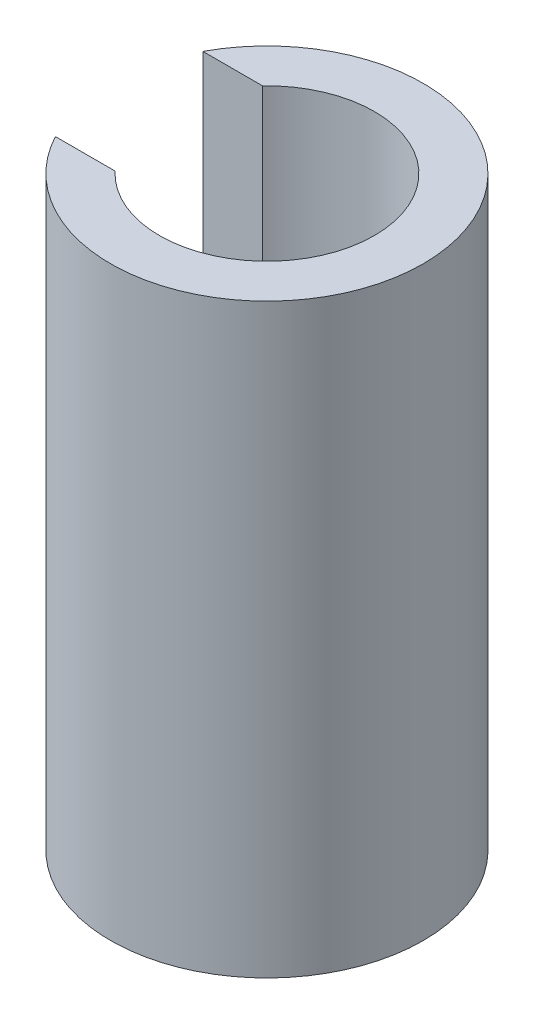
ISO-10303-21;
HEADER;
FILE_DESCRIPTION(('STEP AP214'),'2;1');
FILE_NAME('part.step','',(''),(''),'','','');
FILE_SCHEMA(('AUTOMOTIVE_DESIGN { 1 0 10303 214 1 1 1 1 }'));
ENDSEC;
DATA;
#1=APPLICATION_CONTEXT('core data for automotive mechanical design processes');
#2=APPLICATION_PROTOCOL_DEFINITION('international standard','automotive_design',2000,#1);
#3=PRODUCT_CONTEXT('',#1,'mechanical');
#4=PRODUCT('Part','Part','',(#3));
#5=PRODUCT_RELATED_PRODUCT_CATEGORY('part','',(#4));
#6=PRODUCT_DEFINITION_FORMATION('','',#4);
#7=PRODUCT_DEFINITION_CONTEXT('part definition',#1,'design');
#8=PRODUCT_DEFINITION('design','',#6,#7);
#9=PRODUCT_DEFINITION_SHAPE('','',#8);
#10=(LENGTH_UNIT() NAMED_UNIT(*) SI_UNIT(.MILLI.,.METRE.));
#11=(NAMED_UNIT(*) PLANE_ANGLE_UNIT() SI_UNIT($,.RADIAN.));
#12=(NAMED_UNIT(*) SI_UNIT($,.STERADIAN.) SOLID_ANGLE_UNIT());
#13=UNCERTAINTY_MEASURE_WITH_UNIT(LENGTH_MEASURE(1.E-05),#10,'distance_accuracy_value','');
#14=(GEOMETRIC_REPRESENTATION_CONTEXT(3) GLOBAL_UNCERTAINTY_ASSIGNED_CONTEXT((#13)) GLOBAL_UNIT_ASSIGNED_CONTEXT((#10,
#11,#12)) REPRESENTATION_CONTEXT('',''));
#15=CARTESIAN_POINT('',(0.,0.,0.));
#16=DIRECTION('',(0.,0.,1.));
#17=DIRECTION('',(1.,0.,0.));
#18=AXIS2_PLACEMENT_3D('',#15,#16,#17);
#19=CARTESIAN_POINT('',(0.,15.,0.));
#20=DIRECTION('',(0.,1.,0.));
#21=DIRECTION('',(0.,0.,1.));
#22=AXIS2_PLACEMENT_3D('',#19,#20,#21);
#23=PLANE('',#22);
#24=DIRECTION('',(-1.,0.,0.));
#25=VECTOR('',#24,1.);
#26=CARTESIAN_POINT('',(-4.,15.,-1.88745860881769));
#27=LINE('',#26,#25);
#28=CARTESIAN_POINT('',(-2.,15.,-1.88745860881769));
#29=VERTEX_POINT('',#28);
#30=CARTESIAN_POINT('',(-3.52668399491647,15.,-1.88745860881769));
#31=VERTEX_POINT('',#30);
#32=EDGE_CURVE('E91',#29,#31,#27,.T.);
#33=ORIENTED_EDGE('',*,*,#32,.F.);
#34=CARTESIAN_POINT('',(0.,15.,0.));
#35=DIRECTION('',(0.,1.,0.));
#36=DIRECTION('',(0.,0.,1.));
#37=AXIS2_PLACEMENT_3D('',#34,#35,#36);
#38=CIRCLE('',#37,2.75);
#39=CARTESIAN_POINT('',(-2.,15.,1.88745860881769));
#40=VERTEX_POINT('',#39);
#41=EDGE_CURVE('E94',#40,#29,#38,.T.);
#42=ORIENTED_EDGE('',*,*,#41,.F.);
#43=DIRECTION('',(1.,0.,0.));
#44=VECTOR('',#43,1.);
#45=CARTESIAN_POINT('',(-4.,15.,1.88745860881769));
#46=LINE('',#45,#44);
#47=CARTESIAN_POINT('',(-3.52668399491647,15.,1.88745860881769));
#48=VERTEX_POINT('',#47);
#49=EDGE_CURVE('E59',#48,#40,#46,.T.);
#50=ORIENTED_EDGE('',*,*,#49,.F.);
#51=CARTESIAN_POINT('',(0.,15.,0.));
#52=DIRECTION('',(0.,1.,0.));
#53=DIRECTION('',(0.,0.,1.));
#54=AXIS2_PLACEMENT_3D('',#51,#52,#53);
#55=CIRCLE('',#54,4.);
#56=EDGE_CURVE('E11',#48,#31,#55,.T.);
#57=ORIENTED_EDGE('',*,*,#56,.T.);
#58=EDGE_LOOP('',(#33,#42,#50,#57));
#59=FACE_BOUND('',#58,.T.);
#60=ADVANCED_FACE('F36',(#59),#23,.T.);
#61=CARTESIAN_POINT('',(0.,0.,0.));
#62=DIRECTION('',(0.,1.,0.));
#63=DIRECTION('',(0.,0.,1.));
#64=AXIS2_PLACEMENT_3D('',#61,#62,#63);
#65=PLANE('',#64);
#66=CARTESIAN_POINT('',(0.,0.,0.));
#67=DIRECTION('',(0.,1.,0.));
#68=DIRECTION('',(0.,0.,1.));
#69=AXIS2_PLACEMENT_3D('',#66,#67,#68);
#70=CIRCLE('',#69,2.75);
#71=CARTESIAN_POINT('',(-2.,0.,1.88745860881769));
#72=VERTEX_POINT('',#71);
#73=CARTESIAN_POINT('',(-2.,0.,-1.88745860881769));
#74=VERTEX_POINT('',#73);
#75=EDGE_CURVE('E89',#72,#74,#70,.T.);
#76=ORIENTED_EDGE('',*,*,#75,.T.);
#77=DIRECTION('',(-1.,0.,0.));
#78=VECTOR('',#77,1.);
#79=CARTESIAN_POINT('',(-4.,0.,-1.88745860881769));
#80=LINE('',#79,#78);
#81=CARTESIAN_POINT('',(-3.52668399491647,0.,-1.88745860881769));
#82=VERTEX_POINT('',#81);
#83=EDGE_CURVE('E51',#74,#82,#80,.T.);
#84=ORIENTED_EDGE('',*,*,#83,.T.);
#85=CARTESIAN_POINT('',(0.,0.,0.));
#86=DIRECTION('',(0.,1.,0.));
#87=DIRECTION('',(0.,0.,1.));
#88=AXIS2_PLACEMENT_3D('',#85,#86,#87);
#89=CIRCLE('',#88,4.);
#90=CARTESIAN_POINT('',(-3.52668399491647,0.,1.88745860881769));
#91=VERTEX_POINT('',#90);
#92=EDGE_CURVE('E40',#91,#82,#89,.T.);
#93=ORIENTED_EDGE('',*,*,#92,.F.);
#94=DIRECTION('',(1.,0.,0.));
#95=VECTOR('',#94,1.);
#96=CARTESIAN_POINT('',(-4.,0.,1.88745860881769));
#97=LINE('',#96,#95);
#98=EDGE_CURVE('E77',#91,#72,#97,.T.);
#99=ORIENTED_EDGE('',*,*,#98,.T.);
#100=EDGE_LOOP('',(#76,#84,#93,#99));
#101=FACE_BOUND('',#100,.T.);
#102=ADVANCED_FACE('F88',(#101),#65,.F.);
#103=CARTESIAN_POINT('',(0.,15.,0.));
#104=DIRECTION('',(0.,-1.,0.));
#105=DIRECTION('',(0.,0.,-1.));
#106=AXIS2_PLACEMENT_3D('',#103,#104,#105);
#107=CYLINDRICAL_SURFACE('',#106,4.);
#108=ORIENTED_EDGE('',*,*,#92,.T.);
#109=DIRECTION('',(0.,-1.,0.));
#110=VECTOR('',#109,1.);
#111=CARTESIAN_POINT('',(-3.52668399491647,15.,-1.88745860881769));
#112=LINE('',#111,#110);
#113=EDGE_CURVE('E95',#82,#31,#112,.F.);
#114=ORIENTED_EDGE('',*,*,#113,.T.);
#115=ORIENTED_EDGE('',*,*,#56,.F.);
#116=DIRECTION('',(0.,-1.,0.));
#117=VECTOR('',#116,1.);
#118=CARTESIAN_POINT('',(-3.52668399491647,15.,1.88745860881769));
#119=LINE('',#118,#117);
#120=EDGE_CURVE('E99',#48,#91,#119,.T.);
#121=ORIENTED_EDGE('',*,*,#120,.T.);
#122=EDGE_LOOP('',(#108,#114,#115,#121));
#123=FACE_BOUND('',#122,.T.);
#124=ADVANCED_FACE('F38',(#123),#107,.T.);
#125=CARTESIAN_POINT('',(0.,15.,0.));
#126=DIRECTION('',(0.,-1.,0.));
#127=DIRECTION('',(0.,0.,-1.));
#128=AXIS2_PLACEMENT_3D('',#125,#126,#127);
#129=CYLINDRICAL_SURFACE('',#128,2.75);
#130=DIRECTION('',(0.,1.,0.));
#131=VECTOR('',#130,1.);
#132=CARTESIAN_POINT('',(-2.,0.,-1.88745860881769));
#133=LINE('',#132,#131);
#134=EDGE_CURVE('E83',#74,#29,#133,.T.);
#135=ORIENTED_EDGE('',*,*,#134,.F.);
#136=ORIENTED_EDGE('',*,*,#75,.F.);
#137=DIRECTION('',(0.,1.,0.));
#138=VECTOR('',#137,1.);
#139=CARTESIAN_POINT('',(-2.,0.,1.88745860881769));
#140=LINE('',#139,#138);
#141=EDGE_CURVE('E74',#72,#40,#140,.T.);
#142=ORIENTED_EDGE('',*,*,#141,.T.);
#143=ORIENTED_EDGE('',*,*,#41,.T.);
#144=EDGE_LOOP('',(#135,#136,#142,#143));
#145=FACE_BOUND('',#144,.T.);
#146=ADVANCED_FACE('F93',(#145),#129,.F.);
#147=CARTESIAN_POINT('',(-4.,0.,1.88745860881769));
#148=DIRECTION('',(0.,0.,1.));
#149=DIRECTION('',(1.,0.,0.));
#150=AXIS2_PLACEMENT_3D('',#147,#148,#149);
#151=PLANE('',#150);
#152=ORIENTED_EDGE('',*,*,#49,.T.);
#153=ORIENTED_EDGE('',*,*,#141,.F.);
#154=ORIENTED_EDGE('',*,*,#98,.F.);
#155=ORIENTED_EDGE('',*,*,#120,.F.);
#156=EDGE_LOOP('',(#152,#153,#154,#155));
#157=FACE_BOUND('',#156,.T.);
#158=ADVANCED_FACE('F76',(#157),#151,.F.);
#159=CARTESIAN_POINT('',(-4.,0.,-1.88745860881769));
#160=DIRECTION('',(0.,0.,-1.));
#161=DIRECTION('',(-1.,0.,0.));
#162=AXIS2_PLACEMENT_3D('',#159,#160,#161);
#163=PLANE('',#162);
#164=ORIENTED_EDGE('',*,*,#83,.F.);
#165=ORIENTED_EDGE('',*,*,#134,.T.);
#166=ORIENTED_EDGE('',*,*,#32,.T.);
#167=ORIENTED_EDGE('',*,*,#113,.F.);
#168=EDGE_LOOP('',(#164,#165,#166,#167));
#169=FACE_BOUND('',#168,.T.);
#170=ADVANCED_FACE('F110',(#169),#163,.F.);
#171=CLOSED_SHELL('',(#60,#102,#124,#146,#158,#170));
#172=MANIFOLD_SOLID_BREP('B2',#171);
#173=ADVANCED_BREP_SHAPE_REPRESENTATION('',(#18,#172),#14);
#174=SHAPE_DEFINITION_REPRESENTATION(#9,#173);
ENDSEC;
END-ISO-10303-21;
